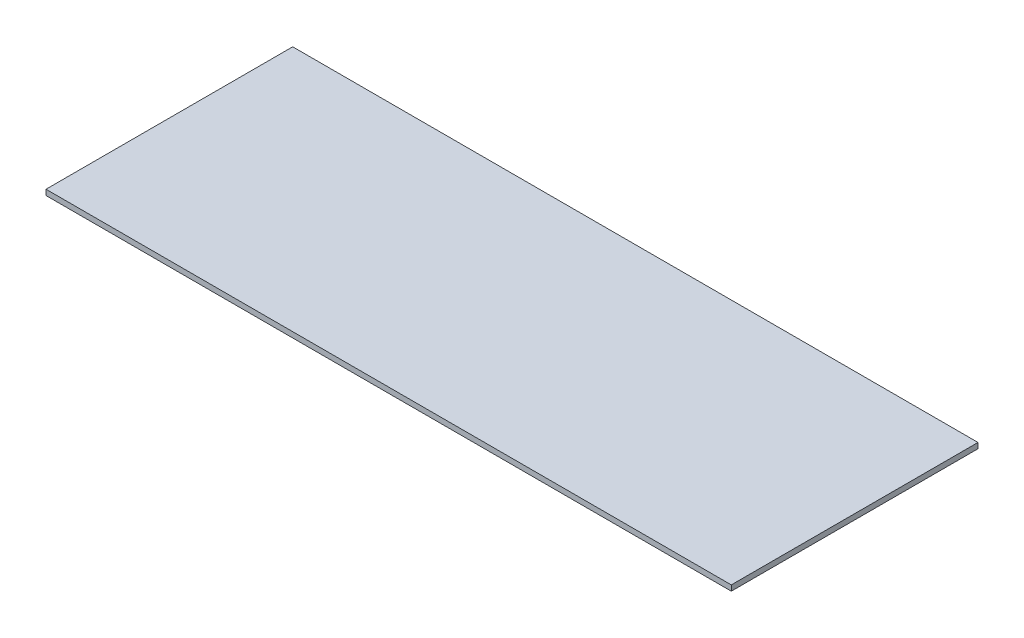
ISO-10303-21;
HEADER;
FILE_DESCRIPTION(('STEP AP214'),'2;1');
FILE_NAME('part.step','',(''),(''),'','','');
FILE_SCHEMA(('AUTOMOTIVE_DESIGN { 1 0 10303 214 1 1 1 1 }'));
ENDSEC;
DATA;
#1=APPLICATION_CONTEXT('core data for automotive mechanical design processes');
#2=APPLICATION_PROTOCOL_DEFINITION('international standard','automotive_design',2000,#1);
#3=PRODUCT_CONTEXT('',#1,'mechanical');
#4=PRODUCT('Part','Part','',(#3));
#5=PRODUCT_RELATED_PRODUCT_CATEGORY('part','',(#4));
#6=PRODUCT_DEFINITION_FORMATION('','',#4);
#7=PRODUCT_DEFINITION_CONTEXT('part definition',#1,'design');
#8=PRODUCT_DEFINITION('design','',#6,#7);
#9=PRODUCT_DEFINITION_SHAPE('','',#8);
#10=(LENGTH_UNIT() NAMED_UNIT(*) SI_UNIT(.MILLI.,.METRE.));
#11=(NAMED_UNIT(*) PLANE_ANGLE_UNIT() SI_UNIT($,.RADIAN.));
#12=(NAMED_UNIT(*) SI_UNIT($,.STERADIAN.) SOLID_ANGLE_UNIT());
#13=UNCERTAINTY_MEASURE_WITH_UNIT(LENGTH_MEASURE(1.E-05),#10,'distance_accuracy_value','');
#14=(GEOMETRIC_REPRESENTATION_CONTEXT(3) GLOBAL_UNCERTAINTY_ASSIGNED_CONTEXT((#13)) GLOBAL_UNIT_ASSIGNED_CONTEXT((#10,
#11,#12)) REPRESENTATION_CONTEXT('',''));
#15=CARTESIAN_POINT('',(0.,0.,0.));
#16=DIRECTION('',(0.,0.,1.));
#17=DIRECTION('',(1.,0.,0.));
#18=AXIS2_PLACEMENT_3D('',#15,#16,#17);
#19=CARTESIAN_POINT('',(625.,10.,-225.));
#20=DIRECTION('',(-1.,0.,0.));
#21=DIRECTION('',(0.,0.,1.));
#22=AXIS2_PLACEMENT_3D('',#19,#20,#21);
#23=PLANE('',#22);
#24=DIRECTION('',(0.,0.,-1.));
#25=VECTOR('',#24,1.);
#26=CARTESIAN_POINT('',(625.,0.,-225.));
#27=LINE('',#26,#25);
#28=CARTESIAN_POINT('',(625.,0.,225.));
#29=VERTEX_POINT('',#28);
#30=CARTESIAN_POINT('',(625.,0.,-225.));
#31=VERTEX_POINT('',#30);
#32=EDGE_CURVE('E113',#29,#31,#27,.T.);
#33=ORIENTED_EDGE('',*,*,#32,.T.);
#34=DIRECTION('',(0.,-1.,0.));
#35=VECTOR('',#34,1.);
#36=CARTESIAN_POINT('',(625.,10.,-225.));
#37=LINE('',#36,#35);
#38=CARTESIAN_POINT('',(625.,10.,-225.));
#39=VERTEX_POINT('',#38);
#40=EDGE_CURVE('E11',#39,#31,#37,.T.);
#41=ORIENTED_EDGE('',*,*,#40,.F.);
#42=DIRECTION('',(0.,0.,-1.));
#43=VECTOR('',#42,1.);
#44=CARTESIAN_POINT('',(625.,10.,-225.));
#45=LINE('',#44,#43);
#46=CARTESIAN_POINT('',(625.,10.,225.));
#47=VERTEX_POINT('',#46);
#48=EDGE_CURVE('E97',#47,#39,#45,.T.);
#49=ORIENTED_EDGE('',*,*,#48,.F.);
#50=DIRECTION('',(0.,-1.,0.));
#51=VECTOR('',#50,1.);
#52=CARTESIAN_POINT('',(625.,10.,225.));
#53=LINE('',#52,#51);
#54=EDGE_CURVE('E109',#47,#29,#53,.T.);
#55=ORIENTED_EDGE('',*,*,#54,.T.);
#56=EDGE_LOOP('',(#33,#41,#49,#55));
#57=FACE_BOUND('',#56,.T.);
#58=ADVANCED_FACE('F45',(#57),#23,.F.);
#59=CARTESIAN_POINT('',(-625.,10.,-225.));
#60=DIRECTION('',(0.,0.,1.));
#61=DIRECTION('',(1.,0.,0.));
#62=AXIS2_PLACEMENT_3D('',#59,#60,#61);
#63=PLANE('',#62);
#64=DIRECTION('',(-1.,0.,0.));
#65=VECTOR('',#64,1.);
#66=CARTESIAN_POINT('',(-625.,0.,-225.));
#67=LINE('',#66,#65);
#68=CARTESIAN_POINT('',(-625.,0.,-225.));
#69=VERTEX_POINT('',#68);
#70=EDGE_CURVE('E102',#31,#69,#67,.T.);
#71=ORIENTED_EDGE('',*,*,#70,.T.);
#72=DIRECTION('',(0.,-1.,0.));
#73=VECTOR('',#72,1.);
#74=CARTESIAN_POINT('',(-625.,10.,-225.));
#75=LINE('',#74,#73);
#76=CARTESIAN_POINT('',(-625.,10.,-225.));
#77=VERTEX_POINT('',#76);
#78=EDGE_CURVE('E54',#77,#69,#75,.T.);
#79=ORIENTED_EDGE('',*,*,#78,.F.);
#80=DIRECTION('',(-1.,0.,0.));
#81=VECTOR('',#80,1.);
#82=CARTESIAN_POINT('',(-625.,10.,-225.));
#83=LINE('',#82,#81);
#84=EDGE_CURVE('E92',#39,#77,#83,.T.);
#85=ORIENTED_EDGE('',*,*,#84,.F.);
#86=ORIENTED_EDGE('',*,*,#40,.T.);
#87=EDGE_LOOP('',(#71,#79,#85,#86));
#88=FACE_BOUND('',#87,.T.);
#89=ADVANCED_FACE('F101',(#88),#63,.F.);
#90=CARTESIAN_POINT('',(-625.,10.,-225.));
#91=DIRECTION('',(1.,0.,0.));
#92=DIRECTION('',(0.,0.,-1.));
#93=AXIS2_PLACEMENT_3D('',#90,#91,#92);
#94=PLANE('',#93);
#95=DIRECTION('',(0.,0.,1.));
#96=VECTOR('',#95,1.);
#97=CARTESIAN_POINT('',(-625.,0.,-225.));
#98=LINE('',#97,#96);
#99=CARTESIAN_POINT('',(-625.,0.,225.));
#100=VERTEX_POINT('',#99);
#101=EDGE_CURVE('E79',#69,#100,#98,.T.);
#102=ORIENTED_EDGE('',*,*,#101,.T.);
#103=DIRECTION('',(0.,-1.,0.));
#104=VECTOR('',#103,1.);
#105=CARTESIAN_POINT('',(-625.,10.,225.));
#106=LINE('',#105,#104);
#107=CARTESIAN_POINT('',(-625.,10.,225.));
#108=VERTEX_POINT('',#107);
#109=EDGE_CURVE('E104',#108,#100,#106,.T.);
#110=ORIENTED_EDGE('',*,*,#109,.F.);
#111=DIRECTION('',(0.,0.,1.));
#112=VECTOR('',#111,1.);
#113=CARTESIAN_POINT('',(-625.,10.,-225.));
#114=LINE('',#113,#112);
#115=EDGE_CURVE('E95',#77,#108,#114,.T.);
#116=ORIENTED_EDGE('',*,*,#115,.F.);
#117=ORIENTED_EDGE('',*,*,#78,.T.);
#118=EDGE_LOOP('',(#102,#110,#116,#117));
#119=FACE_BOUND('',#118,.T.);
#120=ADVANCED_FACE('F105',(#119),#94,.F.);
#121=CARTESIAN_POINT('',(-625.,10.,225.));
#122=DIRECTION('',(0.,0.,-1.));
#123=DIRECTION('',(-1.,0.,0.));
#124=AXIS2_PLACEMENT_3D('',#121,#122,#123);
#125=PLANE('',#124);
#126=DIRECTION('',(1.,0.,0.));
#127=VECTOR('',#126,1.);
#128=CARTESIAN_POINT('',(-625.,0.,225.));
#129=LINE('',#128,#127);
#130=EDGE_CURVE('E85',#100,#29,#129,.T.);
#131=ORIENTED_EDGE('',*,*,#130,.T.);
#132=ORIENTED_EDGE('',*,*,#54,.F.);
#133=DIRECTION('',(1.,0.,0.));
#134=VECTOR('',#133,1.);
#135=CARTESIAN_POINT('',(-625.,10.,225.));
#136=LINE('',#135,#134);
#137=EDGE_CURVE('E62',#108,#47,#136,.T.);
#138=ORIENTED_EDGE('',*,*,#137,.F.);
#139=ORIENTED_EDGE('',*,*,#109,.T.);
#140=EDGE_LOOP('',(#131,#132,#138,#139));
#141=FACE_BOUND('',#140,.T.);
#142=ADVANCED_FACE('F126',(#141),#125,.F.);
#143=CARTESIAN_POINT('',(0.,10.,0.));
#144=DIRECTION('',(0.,1.,0.));
#145=DIRECTION('',(0.,0.,1.));
#146=AXIS2_PLACEMENT_3D('',#143,#144,#145);
#147=PLANE('',#146);
#148=ORIENTED_EDGE('',*,*,#48,.T.);
#149=ORIENTED_EDGE('',*,*,#84,.T.);
#150=ORIENTED_EDGE('',*,*,#115,.T.);
#151=ORIENTED_EDGE('',*,*,#137,.T.);
#152=EDGE_LOOP('',(#148,#149,#150,#151));
#153=FACE_BOUND('',#152,.T.);
#154=ADVANCED_FACE('F93',(#153),#147,.T.);
#155=CARTESIAN_POINT('',(0.,0.,0.));
#156=DIRECTION('',(0.,1.,0.));
#157=DIRECTION('',(0.,0.,1.));
#158=AXIS2_PLACEMENT_3D('',#155,#156,#157);
#159=PLANE('',#158);
#160=ORIENTED_EDGE('',*,*,#32,.F.);
#161=ORIENTED_EDGE('',*,*,#130,.F.);
#162=ORIENTED_EDGE('',*,*,#101,.F.);
#163=ORIENTED_EDGE('',*,*,#70,.F.);
#164=EDGE_LOOP('',(#160,#161,#162,#163));
#165=FACE_BOUND('',#164,.T.);
#166=ADVANCED_FACE('F129',(#165),#159,.F.);
#167=CLOSED_SHELL('',(#58,#89,#120,#142,#154,#166));
#168=MANIFOLD_SOLID_BREP('B2',#167);
#169=ADVANCED_BREP_SHAPE_REPRESENTATION('',(#18,#168),#14);
#170=SHAPE_DEFINITION_REPRESENTATION(#9,#169);
ENDSEC;
END-ISO-10303-21;
